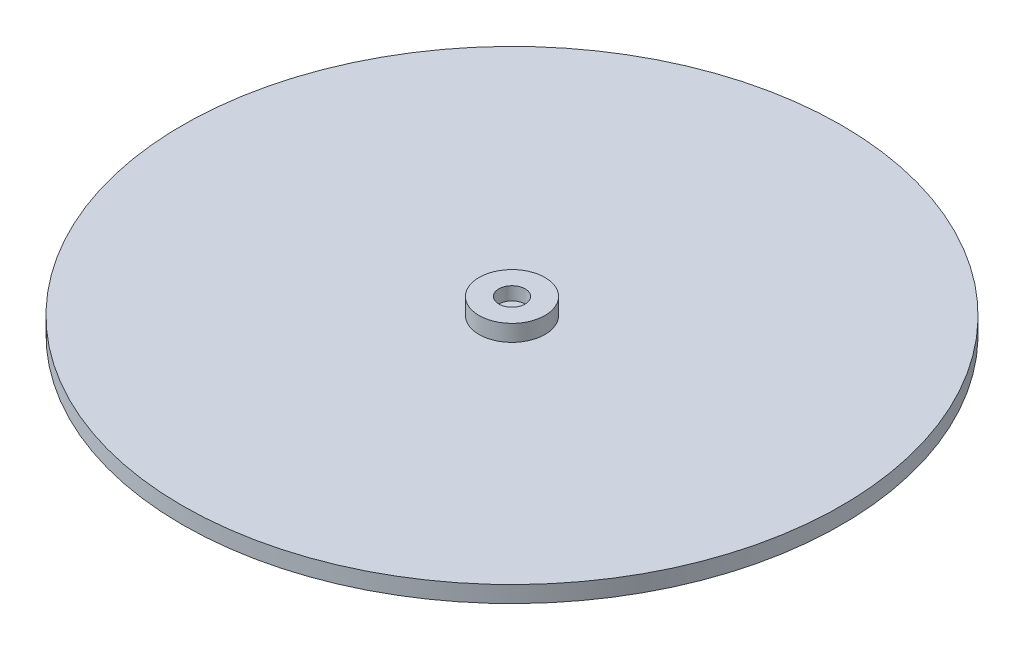
ISO-10303-21;
HEADER;
FILE_DESCRIPTION(('STEP AP214'),'2;1');
FILE_NAME('part.step','',(''),(''),'','','');
FILE_SCHEMA(('AUTOMOTIVE_DESIGN { 1 0 10303 214 1 1 1 1 }'));
ENDSEC;
DATA;
#1=APPLICATION_CONTEXT('core data for automotive mechanical design processes');
#2=APPLICATION_PROTOCOL_DEFINITION('international standard','automotive_design',2000,#1);
#3=PRODUCT_CONTEXT('',#1,'mechanical');
#4=PRODUCT('Part','Part','',(#3));
#5=PRODUCT_RELATED_PRODUCT_CATEGORY('part','',(#4));
#6=PRODUCT_DEFINITION_FORMATION('','',#4);
#7=PRODUCT_DEFINITION_CONTEXT('part definition',#1,'design');
#8=PRODUCT_DEFINITION('design','',#6,#7);
#9=PRODUCT_DEFINITION_SHAPE('','',#8);
#10=(LENGTH_UNIT() NAMED_UNIT(*) SI_UNIT(.MILLI.,.METRE.));
#11=(NAMED_UNIT(*) PLANE_ANGLE_UNIT() SI_UNIT($,.RADIAN.));
#12=(NAMED_UNIT(*) SI_UNIT($,.STERADIAN.) SOLID_ANGLE_UNIT());
#13=UNCERTAINTY_MEASURE_WITH_UNIT(LENGTH_MEASURE(1.E-05),#10,'distance_accuracy_value','');
#14=(GEOMETRIC_REPRESENTATION_CONTEXT(3) GLOBAL_UNCERTAINTY_ASSIGNED_CONTEXT((#13)) GLOBAL_UNIT_ASSIGNED_CONTEXT((#10,
#11,#12)) REPRESENTATION_CONTEXT('',''));
#15=CARTESIAN_POINT('',(0.,0.,0.));
#16=DIRECTION('',(0.,0.,1.));
#17=DIRECTION('',(1.,0.,0.));
#18=AXIS2_PLACEMENT_3D('',#15,#16,#17);
#19=CARTESIAN_POINT('',(0.,25.,0.));
#20=DIRECTION('',(0.,-1.,0.));
#21=DIRECTION('',(0.,0.,-1.));
#22=AXIS2_PLACEMENT_3D('',#19,#20,#21);
#23=CYLINDRICAL_SURFACE('',#22,500.);
#24=CARTESIAN_POINT('',(0.,25.,0.));
#25=DIRECTION('',(0.,1.,0.));
#26=DIRECTION('',(0.,0.,1.));
#27=AXIS2_PLACEMENT_3D('',#24,#25,#26);
#28=CIRCLE('',#27,500.);
#29=CARTESIAN_POINT('',(0.,25.,500.));
#30=VERTEX_POINT('',#29);
#31=EDGE_CURVE('E10',#30,#30,#28,.T.);
#32=ORIENTED_EDGE('',*,*,#31,.F.);
#33=EDGE_LOOP('',(#32));
#34=FACE_BOUND('',#33,.T.);
#35=CARTESIAN_POINT('',(0.,0.,0.));
#36=DIRECTION('',(0.,1.,0.));
#37=DIRECTION('',(0.,0.,1.));
#38=AXIS2_PLACEMENT_3D('',#35,#36,#37);
#39=CIRCLE('',#38,500.);
#40=CARTESIAN_POINT('',(0.,0.,500.));
#41=VERTEX_POINT('',#40);
#42=EDGE_CURVE('E34',#41,#41,#39,.T.);
#43=ORIENTED_EDGE('',*,*,#42,.T.);
#44=EDGE_LOOP('',(#43));
#45=FACE_BOUND('',#44,.T.);
#46=ADVANCED_FACE('F31',(#34,#45),#23,.T.);
#47=CARTESIAN_POINT('',(0.,25.,0.));
#48=DIRECTION('',(0.,1.,0.));
#49=DIRECTION('',(0.,0.,1.));
#50=AXIS2_PLACEMENT_3D('',#47,#48,#49);
#51=PLANE('',#50);
#52=CARTESIAN_POINT('',(0.,25.,0.));
#53=DIRECTION('',(0.,1.,0.));
#54=DIRECTION('',(0.,0.,1.));
#55=AXIS2_PLACEMENT_3D('',#52,#53,#54);
#56=CIRCLE('',#55,50.);
#57=CARTESIAN_POINT('',(0.,25.,50.));
#58=VERTEX_POINT('',#57);
#59=EDGE_CURVE('E43',#58,#58,#56,.T.);
#60=ORIENTED_EDGE('',*,*,#59,.F.);
#61=EDGE_LOOP('',(#60));
#62=FACE_BOUND('',#61,.T.);
#63=ORIENTED_EDGE('',*,*,#31,.T.);
#64=EDGE_LOOP('',(#63));
#65=FACE_BOUND('',#64,.T.);
#66=ADVANCED_FACE('F76',(#62,#65),#51,.T.);
#67=CARTESIAN_POINT('',(0.,0.,0.));
#68=DIRECTION('',(0.,1.,0.));
#69=DIRECTION('',(0.,0.,1.));
#70=AXIS2_PLACEMENT_3D('',#67,#68,#69);
#71=PLANE('',#70);
#72=ORIENTED_EDGE('',*,*,#42,.F.);
#73=EDGE_LOOP('',(#72));
#74=FACE_BOUND('',#73,.T.);
#75=ADVANCED_FACE('F72',(#74),#71,.F.);
#76=CARTESIAN_POINT('',(0.,50.,0.));
#77=DIRECTION('',(0.,-1.,0.));
#78=DIRECTION('',(0.,0.,-1.));
#79=AXIS2_PLACEMENT_3D('',#76,#77,#78);
#80=CYLINDRICAL_SURFACE('',#79,50.);
#81=CARTESIAN_POINT('',(0.,50.,0.));
#82=DIRECTION('',(0.,1.,0.));
#83=DIRECTION('',(0.,0.,1.));
#84=AXIS2_PLACEMENT_3D('',#81,#82,#83);
#85=CIRCLE('',#84,50.);
#86=CARTESIAN_POINT('',(0.,50.,50.));
#87=VERTEX_POINT('',#86);
#88=EDGE_CURVE('E41',#87,#87,#85,.T.);
#89=ORIENTED_EDGE('',*,*,#88,.F.);
#90=EDGE_LOOP('',(#89));
#91=FACE_BOUND('',#90,.T.);
#92=ORIENTED_EDGE('',*,*,#59,.T.);
#93=EDGE_LOOP('',(#92));
#94=FACE_BOUND('',#93,.T.);
#95=ADVANCED_FACE('F66',(#91,#94),#80,.T.);
#96=CARTESIAN_POINT('',(0.,50.,0.));
#97=DIRECTION('',(0.,1.,0.));
#98=DIRECTION('',(0.,0.,1.));
#99=AXIS2_PLACEMENT_3D('',#96,#97,#98);
#100=PLANE('',#99);
#101=CARTESIAN_POINT('',(0.,50.,0.));
#102=DIRECTION('',(0.,1.,0.));
#103=DIRECTION('',(0.,0.,1.));
#104=AXIS2_PLACEMENT_3D('',#101,#102,#103);
#105=CIRCLE('',#104,20.);
#106=CARTESIAN_POINT('',(0.,50.,20.));
#107=VERTEX_POINT('',#106);
#108=EDGE_CURVE('E49',#107,#107,#105,.T.);
#109=ORIENTED_EDGE('',*,*,#108,.F.);
#110=EDGE_LOOP('',(#109));
#111=FACE_BOUND('',#110,.T.);
#112=ORIENTED_EDGE('',*,*,#88,.T.);
#113=EDGE_LOOP('',(#112));
#114=FACE_BOUND('',#113,.T.);
#115=ADVANCED_FACE('F60',(#111,#114),#100,.T.);
#116=CARTESIAN_POINT('',(0.,30.,0.));
#117=DIRECTION('',(0.,1.,0.));
#118=DIRECTION('',(0.,0.,1.));
#119=AXIS2_PLACEMENT_3D('',#116,#117,#118);
#120=CYLINDRICAL_SURFACE('',#119,20.);
#121=CARTESIAN_POINT('',(0.,30.,0.));
#122=DIRECTION('',(0.,1.,0.));
#123=DIRECTION('',(0.,0.,1.));
#124=AXIS2_PLACEMENT_3D('',#121,#122,#123);
#125=CIRCLE('',#124,20.);
#126=CARTESIAN_POINT('',(0.,30.,20.));
#127=VERTEX_POINT('',#126);
#128=EDGE_CURVE('E46',#127,#127,#125,.T.);
#129=ORIENTED_EDGE('',*,*,#128,.F.);
#130=EDGE_LOOP('',(#129));
#131=FACE_BOUND('',#130,.T.);
#132=ORIENTED_EDGE('',*,*,#108,.T.);
#133=EDGE_LOOP('',(#132));
#134=FACE_BOUND('',#133,.T.);
#135=ADVANCED_FACE('F57',(#131,#134),#120,.F.);
#136=CARTESIAN_POINT('',(0.,30.,0.));
#137=DIRECTION('',(0.,1.,0.));
#138=DIRECTION('',(0.,0.,1.));
#139=AXIS2_PLACEMENT_3D('',#136,#137,#138);
#140=PLANE('',#139);
#141=ORIENTED_EDGE('',*,*,#128,.T.);
#142=EDGE_LOOP('',(#141));
#143=FACE_BOUND('',#142,.T.);
#144=ADVANCED_FACE('F55',(#143),#140,.T.);
#145=CLOSED_SHELL('',(#46,#66,#75,#95,#115,#135,#144));
#146=MANIFOLD_SOLID_BREP('B2',#145);
#147=ADVANCED_BREP_SHAPE_REPRESENTATION('',(#18,#146),#14);
#148=SHAPE_DEFINITION_REPRESENTATION(#9,#147);
ENDSEC;
END-ISO-10303-21;
